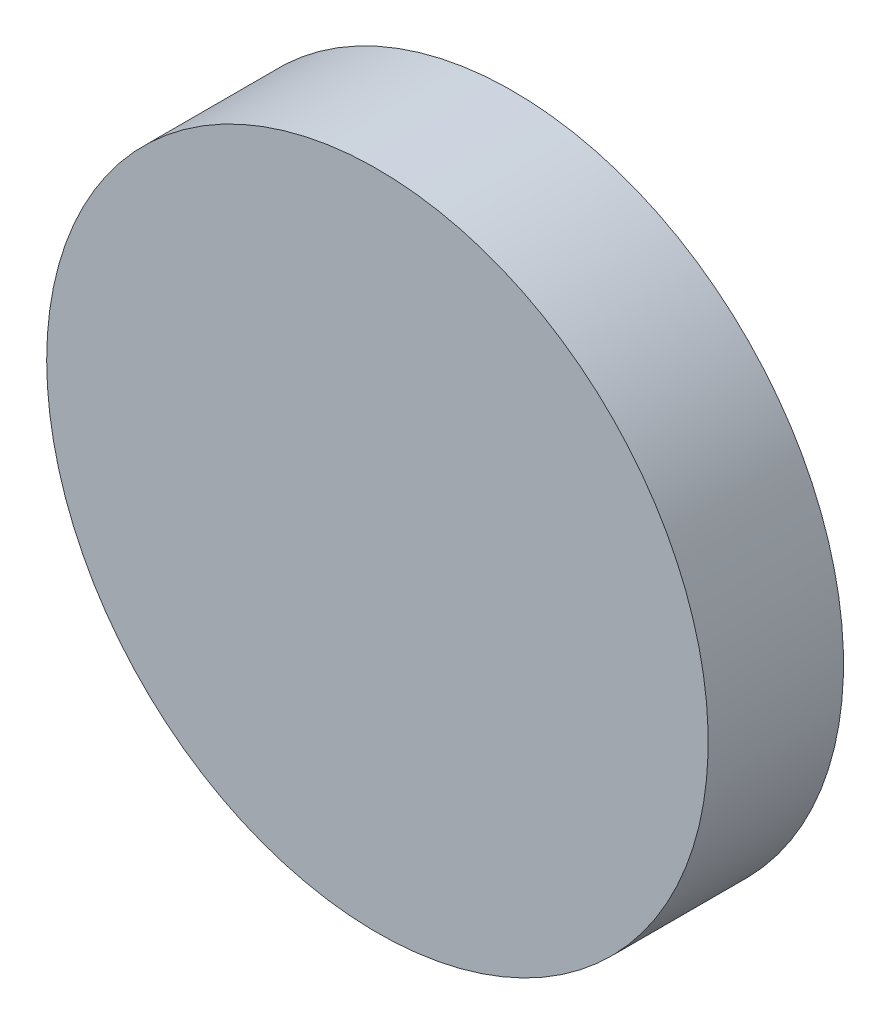
ISO-10303-21;
HEADER;
FILE_DESCRIPTION(('STEP AP214'),'2;1');
FILE_NAME('part.step','',(''),(''),'','','');
FILE_SCHEMA(('AUTOMOTIVE_DESIGN { 1 0 10303 214 1 1 1 1 }'));
ENDSEC;
DATA;
#1=APPLICATION_CONTEXT('core data for automotive mechanical design processes');
#2=APPLICATION_PROTOCOL_DEFINITION('international standard','automotive_design',2000,#1);
#3=PRODUCT_CONTEXT('',#1,'mechanical');
#4=PRODUCT('Part','Part','',(#3));
#5=PRODUCT_RELATED_PRODUCT_CATEGORY('part','',(#4));
#6=PRODUCT_DEFINITION_FORMATION('','',#4);
#7=PRODUCT_DEFINITION_CONTEXT('part definition',#1,'design');
#8=PRODUCT_DEFINITION('design','',#6,#7);
#9=PRODUCT_DEFINITION_SHAPE('','',#8);
#10=(LENGTH_UNIT() NAMED_UNIT(*) SI_UNIT(.MILLI.,.METRE.));
#11=(NAMED_UNIT(*) PLANE_ANGLE_UNIT() SI_UNIT($,.RADIAN.));
#12=(NAMED_UNIT(*) SI_UNIT($,.STERADIAN.) SOLID_ANGLE_UNIT());
#13=UNCERTAINTY_MEASURE_WITH_UNIT(LENGTH_MEASURE(1.E-05),#10,'distance_accuracy_value','');
#14=(GEOMETRIC_REPRESENTATION_CONTEXT(3) GLOBAL_UNCERTAINTY_ASSIGNED_CONTEXT((#13)) GLOBAL_UNIT_ASSIGNED_CONTEXT((#10,
#11,#12)) REPRESENTATION_CONTEXT('',''));
#15=CARTESIAN_POINT('',(0.,0.,0.));
#16=DIRECTION('',(0.,0.,1.));
#17=DIRECTION('',(1.,0.,0.));
#18=AXIS2_PLACEMENT_3D('',#15,#16,#17);
#19=CARTESIAN_POINT('',(0.,0.,0.));
#20=DIRECTION('',(0.,0.,1.));
#21=DIRECTION('',(1.,0.,0.));
#22=AXIS2_PLACEMENT_3D('',#19,#20,#21);
#23=PLANE('',#22);
#24=CARTESIAN_POINT('',(0.,0.,0.));
#25=DIRECTION('',(0.,0.,1.));
#26=DIRECTION('',(1.,0.,0.));
#27=AXIS2_PLACEMENT_3D('',#24,#25,#26);
#28=CIRCLE('',#27,110.);
#29=CARTESIAN_POINT('',(-110.,0.,0.));
#30=VERTEX_POINT('',#29);
#31=EDGE_CURVE('E37',#30,#30,#28,.T.);
#32=ORIENTED_EDGE('',*,*,#31,.F.);
#33=EDGE_LOOP('',(#32));
#34=FACE_BOUND('',#33,.T.);
#35=CARTESIAN_POINT('',(0.,0.,0.));
#36=DIRECTION('',(0.,0.,1.));
#37=DIRECTION('',(1.,0.,0.));
#38=AXIS2_PLACEMENT_3D('',#35,#36,#37);
#39=CIRCLE('',#38,91.6);
#40=CARTESIAN_POINT('',(91.6,0.,0.));
#41=VERTEX_POINT('',#40);
#42=EDGE_CURVE('E48',#41,#41,#39,.T.);
#43=ORIENTED_EDGE('',*,*,#42,.T.);
#44=EDGE_LOOP('',(#43));
#45=FACE_BOUND('',#44,.T.);
#46=ADVANCED_FACE('F33',(#34,#45),#23,.F.);
#47=CARTESIAN_POINT('',(0.,0.,45.));
#48=DIRECTION('',(0.,0.,-1.));
#49=DIRECTION('',(-1.,0.,0.));
#50=AXIS2_PLACEMENT_3D('',#47,#48,#49);
#51=CYLINDRICAL_SURFACE('',#50,110.);
#52=CARTESIAN_POINT('',(0.,0.,45.));
#53=DIRECTION('',(0.,0.,1.));
#54=DIRECTION('',(1.,0.,0.));
#55=AXIS2_PLACEMENT_3D('',#52,#53,#54);
#56=CIRCLE('',#55,110.);
#57=CARTESIAN_POINT('',(-110.,0.,45.));
#58=VERTEX_POINT('',#57);
#59=EDGE_CURVE('E11',#58,#58,#56,.T.);
#60=CARTESIAN_POINT('',(-110.,0.,45.));
#61=CARTESIAN_POINT('',(-110.,0.,44.53125));
#62=CARTESIAN_POINT('',(-110.,0.,44.0625));
#63=CARTESIAN_POINT('',(-110.,0.,43.125));
#64=CARTESIAN_POINT('',(-110.,0.,42.65625));
#65=CARTESIAN_POINT('',(-110.,0.,41.71875));
#66=CARTESIAN_POINT('',(-110.,0.,41.25));
#67=CARTESIAN_POINT('',(-110.,0.,40.3125));
#68=CARTESIAN_POINT('',(-110.,0.,39.84375));
#69=CARTESIAN_POINT('',(-110.,0.,38.90625));
#70=CARTESIAN_POINT('',(-110.,0.,38.4375));
#71=CARTESIAN_POINT('',(-110.,0.,37.5));
#72=CARTESIAN_POINT('',(-110.,0.,37.03125));
#73=CARTESIAN_POINT('',(-110.,0.,36.09375));
#74=CARTESIAN_POINT('',(-110.,0.,35.625));
#75=CARTESIAN_POINT('',(-110.,0.,34.6875));
#76=CARTESIAN_POINT('',(-110.,0.,34.21875));
#77=CARTESIAN_POINT('',(-110.,0.,33.28125));
#78=CARTESIAN_POINT('',(-110.,0.,32.8125));
#79=CARTESIAN_POINT('',(-110.,0.,31.875));
#80=CARTESIAN_POINT('',(-110.,0.,31.40625));
#81=CARTESIAN_POINT('',(-110.,0.,30.46875));
#82=CARTESIAN_POINT('',(-110.,0.,30.));
#83=CARTESIAN_POINT('',(-110.,0.,29.0625));
#84=CARTESIAN_POINT('',(-110.,0.,28.59375));
#85=CARTESIAN_POINT('',(-110.,0.,27.65625));
#86=CARTESIAN_POINT('',(-110.,0.,27.1875));
#87=CARTESIAN_POINT('',(-110.,0.,26.25));
#88=CARTESIAN_POINT('',(-110.,0.,25.78125));
#89=CARTESIAN_POINT('',(-110.,0.,24.84375));
#90=CARTESIAN_POINT('',(-110.,0.,24.375));
#91=CARTESIAN_POINT('',(-110.,0.,23.4375));
#92=CARTESIAN_POINT('',(-110.,0.,22.96875));
#93=CARTESIAN_POINT('',(-110.,0.,22.03125));
#94=CARTESIAN_POINT('',(-110.,0.,21.5625));
#95=CARTESIAN_POINT('',(-110.,0.,20.625));
#96=CARTESIAN_POINT('',(-110.,0.,20.15625));
#97=CARTESIAN_POINT('',(-110.,0.,19.21875));
#98=CARTESIAN_POINT('',(-110.,0.,18.75));
#99=CARTESIAN_POINT('',(-110.,0.,17.8125));
#100=CARTESIAN_POINT('',(-110.,0.,17.34375));
#101=CARTESIAN_POINT('',(-110.,0.,16.40625));
#102=CARTESIAN_POINT('',(-110.,0.,15.9375));
#103=CARTESIAN_POINT('',(-110.,0.,15.));
#104=CARTESIAN_POINT('',(-110.,0.,14.53125));
#105=CARTESIAN_POINT('',(-110.,0.,13.59375));
#106=CARTESIAN_POINT('',(-110.,0.,13.125));
#107=CARTESIAN_POINT('',(-110.,0.,12.1875));
#108=CARTESIAN_POINT('',(-110.,0.,11.71875));
#109=CARTESIAN_POINT('',(-110.,0.,10.78125));
#110=CARTESIAN_POINT('',(-110.,0.,10.3125));
#111=CARTESIAN_POINT('',(-110.,0.,9.375));
#112=CARTESIAN_POINT('',(-110.,0.,8.90625));
#113=CARTESIAN_POINT('',(-110.,0.,7.96874999999999));
#114=CARTESIAN_POINT('',(-110.,0.,7.5));
#115=CARTESIAN_POINT('',(-110.,0.,6.5625));
#116=CARTESIAN_POINT('',(-110.,0.,6.09375));
#117=CARTESIAN_POINT('',(-110.,0.,5.15625));
#118=CARTESIAN_POINT('',(-110.,0.,4.68749999999999));
#119=CARTESIAN_POINT('',(-110.,0.,3.74999999999999));
#120=CARTESIAN_POINT('',(-110.,0.,3.28124999999999));
#121=CARTESIAN_POINT('',(-110.,0.,2.34374999999999));
#122=CARTESIAN_POINT('',(-110.,0.,1.87499999999999));
#123=CARTESIAN_POINT('',(-110.,0.,0.937499999999992));
#124=CARTESIAN_POINT('',(-110.,0.,0.468749999999993));
#125=CARTESIAN_POINT('',(-110.,0.,0.));
#126=B_SPLINE_CURVE_WITH_KNOTS('',3,(#60,#61,#62,#63,#64,#65,#66,#67,#68,#69,#70,#71,#72,#73,
#74,#75,#76,#77,#78,#79,#80,#81,#82,#83,#84,#85,#86,#87,#88,#89,#90,#91,#92,#93,#94,#95,#96,#97,
#98,#99,#100,#101,#102,#103,#104,#105,#106,#107,#108,#109,#110,#111,#112,#113,#114,#115,#116,
#117,#118,#119,#120,#121,#122,#123,#124,#125),.UNSPECIFIED.,.F.,.F.,(4,2,2,2,2,2,2,2,2,2,2,2,2,
2,2,2,2,2,2,2,2,2,2,2,2,2,2,2,2,2,2,2,4),(0.,1.40625,2.8125,4.21875000000001,5.62500000000001,
7.03125,8.4375,9.84375000000001,11.25,12.65625,14.0625,15.46875,16.875,18.28125,19.6875,
21.09375,22.5,23.90625,25.3125,26.71875,28.125,29.53125,30.9375,32.34375,33.75,35.15625,36.5625,
37.96875,39.375,40.78125,42.1875,43.59375,45.),.UNSPECIFIED.);
#127=EDGE_CURVE('BSEAM35',#58,#30,#126,.T.);
#128=ORIENTED_EDGE('',*,*,#59,.F.);
#129=ORIENTED_EDGE('',*,*,#31,.T.);
#130=ORIENTED_EDGE('',*,*,#127,.T.);
#131=ORIENTED_EDGE('',*,*,#127,.F.);
#132=EDGE_LOOP('',(#128,#130,#129,#131));
#133=FACE_BOUND('',#132,.T.);
#134=ADVANCED_FACE('F35',(#133),#51,.T.);
#135=CARTESIAN_POINT('',(0.,0.,45.));
#136=DIRECTION('',(0.,0.,1.));
#137=DIRECTION('',(1.,0.,0.));
#138=AXIS2_PLACEMENT_3D('',#135,#136,#137);
#139=PLANE('',#138);
#140=ORIENTED_EDGE('',*,*,#59,.T.);
#141=EDGE_LOOP('',(#140));
#142=FACE_BOUND('',#141,.T.);
#143=ADVANCED_FACE('F57',(#142),#139,.T.);
#144=CARTESIAN_POINT('',(0.,0.,304.083924626751));
#145=DIRECTION('',(0.,0.,-1.));
#146=DIRECTION('',(-1.,0.,0.));
#147=AXIS2_PLACEMENT_3D('',#144,#145,#146);
#148=CYLINDRICAL_SURFACE('',#147,91.6);
#149=ORIENTED_EDGE('',*,*,#42,.F.);
#150=EDGE_LOOP('',(#149));
#151=FACE_BOUND('',#150,.T.);
#152=CARTESIAN_POINT('',(0.,0.,35.));
#153=DIRECTION('',(0.,0.,1.));
#154=DIRECTION('',(1.,0.,0.));
#155=AXIS2_PLACEMENT_3D('',#152,#153,#154);
#156=CIRCLE('',#155,91.6);
#157=CARTESIAN_POINT('',(91.6,0.,35.));
#158=VERTEX_POINT('',#157);
#159=EDGE_CURVE('E44',#158,#158,#156,.T.);
#160=ORIENTED_EDGE('',*,*,#159,.T.);
#161=EDGE_LOOP('',(#160));
#162=FACE_BOUND('',#161,.T.);
#163=ADVANCED_FACE('F53',(#151,#162),#148,.F.);
#164=CARTESIAN_POINT('',(0.,0.,35.));
#165=DIRECTION('',(0.,0.,1.));
#166=DIRECTION('',(1.,0.,0.));
#167=AXIS2_PLACEMENT_3D('',#164,#165,#166);
#168=PLANE('',#167);
#169=ORIENTED_EDGE('',*,*,#159,.F.);
#170=EDGE_LOOP('',(#169));
#171=FACE_BOUND('',#170,.T.);
#172=ADVANCED_FACE('F56',(#171),#168,.F.);
#173=CLOSED_SHELL('',(#46,#134,#143,#163,#172));
#174=MANIFOLD_SOLID_BREP('B2',#173);
#175=ADVANCED_BREP_SHAPE_REPRESENTATION('',(#18,#174),#14);
#176=SHAPE_DEFINITION_REPRESENTATION(#9,#175);
ENDSEC;
END-ISO-10303-21;
